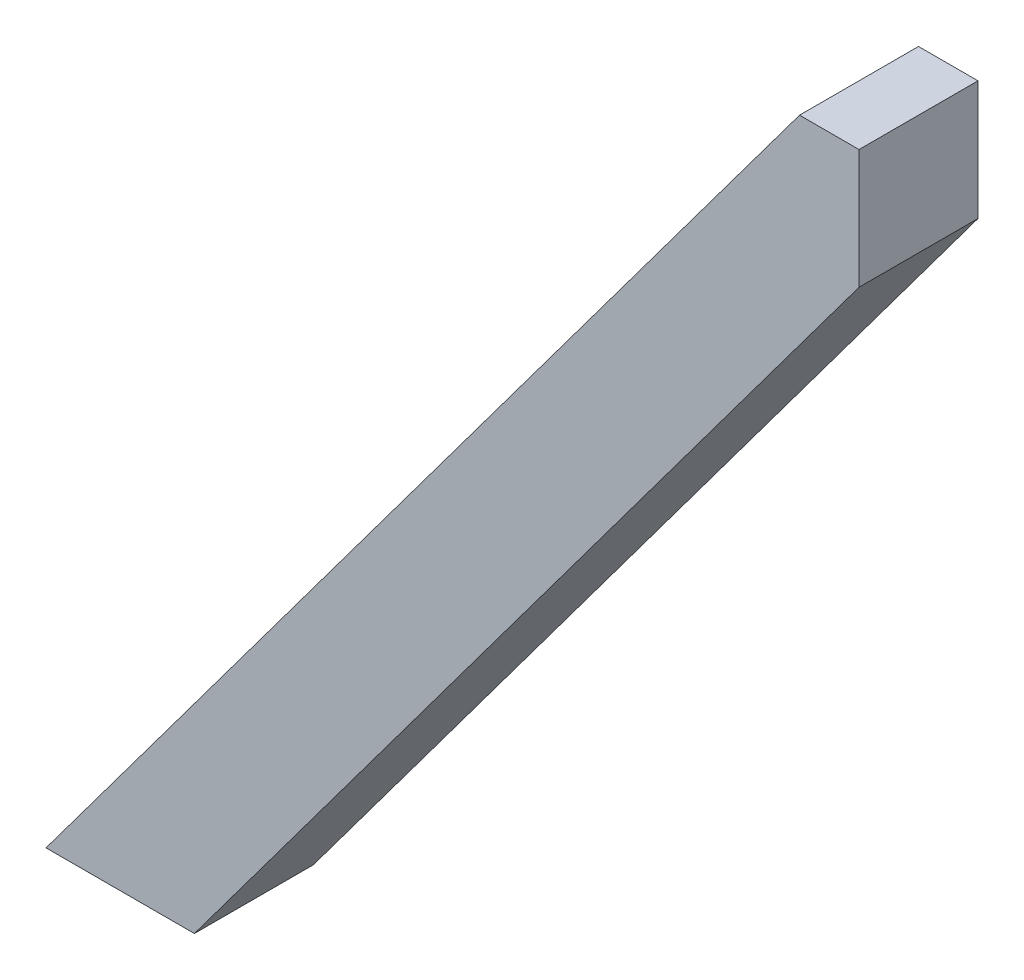
ISO-10303-21;
HEADER;
FILE_DESCRIPTION(('STEP AP214'),'2;1');
FILE_NAME('part.step','',(''),(''),'','','');
FILE_SCHEMA(('AUTOMOTIVE_DESIGN { 1 0 10303 214 1 1 1 1 }'));
ENDSEC;
DATA;
#1=APPLICATION_CONTEXT('core data for automotive mechanical design processes');
#2=APPLICATION_PROTOCOL_DEFINITION('international standard','automotive_design',2000,#1);
#3=PRODUCT_CONTEXT('',#1,'mechanical');
#4=PRODUCT('Part','Part','',(#3));
#5=PRODUCT_RELATED_PRODUCT_CATEGORY('part','',(#4));
#6=PRODUCT_DEFINITION_FORMATION('','',#4);
#7=PRODUCT_DEFINITION_CONTEXT('part definition',#1,'design');
#8=PRODUCT_DEFINITION('design','',#6,#7);
#9=PRODUCT_DEFINITION_SHAPE('','',#8);
#10=(LENGTH_UNIT() NAMED_UNIT(*) SI_UNIT(.MILLI.,.METRE.));
#11=(NAMED_UNIT(*) PLANE_ANGLE_UNIT() SI_UNIT($,.RADIAN.));
#12=(NAMED_UNIT(*) SI_UNIT($,.STERADIAN.) SOLID_ANGLE_UNIT());
#13=UNCERTAINTY_MEASURE_WITH_UNIT(LENGTH_MEASURE(1.E-05),#10,'distance_accuracy_value','');
#14=(GEOMETRIC_REPRESENTATION_CONTEXT(3) GLOBAL_UNCERTAINTY_ASSIGNED_CONTEXT((#13)) GLOBAL_UNIT_ASSIGNED_CONTEXT((#10,
#11,#12)) REPRESENTATION_CONTEXT('',''));
#15=CARTESIAN_POINT('',(0.,0.,0.));
#16=DIRECTION('',(0.,0.,1.));
#17=DIRECTION('',(1.,0.,0.));
#18=AXIS2_PLACEMENT_3D('',#15,#16,#17);
#19=CARTESIAN_POINT('',(482.603129708303,647.69766068999,76.2));
#20=DIRECTION('',(0.801879937296559,-0.597485201625335,0.));
#21=DIRECTION('',(0.597485201625335,0.801879937296559,0.));
#22=AXIS2_PLACEMENT_3D('',#19,#20,#21);
#23=PLANE('',#22);
#24=DIRECTION('',(-0.597485201625335,-0.801879937296559,0.));
#25=VECTOR('',#24,1.);
#26=CARTESIAN_POINT('',(482.603129708303,647.69766068999,0.));
#27=LINE('',#26,#25);
#28=CARTESIAN_POINT('',(482.603129708303,647.69766068999,0.));
#29=VERTEX_POINT('',#28);
#30=CARTESIAN_POINT('',(0.,0.,0.));
#31=VERTEX_POINT('',#30);
#32=EDGE_CURVE('E123',#29,#31,#27,.T.);
#33=ORIENTED_EDGE('',*,*,#32,.T.);
#34=DIRECTION('',(0.,0.,-1.));
#35=VECTOR('',#34,1.);
#36=CARTESIAN_POINT('',(0.,0.,76.2));
#37=LINE('',#36,#35);
#38=CARTESIAN_POINT('',(0.,0.,76.2));
#39=VERTEX_POINT('',#38);
#40=EDGE_CURVE('E11',#39,#31,#37,.T.);
#41=ORIENTED_EDGE('',*,*,#40,.F.);
#42=DIRECTION('',(-0.597485201625335,-0.801879937296559,0.));
#43=VECTOR('',#42,1.);
#44=CARTESIAN_POINT('',(482.603129708303,647.69766068999,76.2));
#45=LINE('',#44,#43);
#46=CARTESIAN_POINT('',(482.603129708303,647.69766068999,76.2));
#47=VERTEX_POINT('',#46);
#48=EDGE_CURVE('E136',#47,#39,#45,.T.);
#49=ORIENTED_EDGE('',*,*,#48,.F.);
#50=DIRECTION('',(0.,0.,-1.));
#51=VECTOR('',#50,1.);
#52=CARTESIAN_POINT('',(482.603129708303,647.69766068999,76.2));
#53=LINE('',#52,#51);
#54=EDGE_CURVE('E119',#47,#29,#53,.T.);
#55=ORIENTED_EDGE('',*,*,#54,.T.);
#56=EDGE_LOOP('',(#33,#41,#49,#55));
#57=FACE_BOUND('',#56,.T.);
#58=ADVANCED_FACE('F43',(#57),#23,.F.);
#59=CARTESIAN_POINT('',(0.,0.,76.2));
#60=DIRECTION('',(0.,1.,0.));
#61=DIRECTION('',(0.,0.,1.));
#62=AXIS2_PLACEMENT_3D('',#59,#60,#61);
#63=PLANE('',#62);
#64=DIRECTION('',(1.,0.,0.));
#65=VECTOR('',#64,1.);
#66=CARTESIAN_POINT('',(0.,0.,0.));
#67=LINE('',#66,#65);
#68=CARTESIAN_POINT('',(95.0266947155444,0.,0.));
#69=VERTEX_POINT('',#68);
#70=EDGE_CURVE('E127',#31,#69,#67,.T.);
#71=ORIENTED_EDGE('',*,*,#70,.T.);
#72=DIRECTION('',(0.,0.,-1.));
#73=VECTOR('',#72,1.);
#74=CARTESIAN_POINT('',(95.0266947155444,0.,76.2));
#75=LINE('',#74,#73);
#76=CARTESIAN_POINT('',(95.0266947155444,0.,76.2));
#77=VERTEX_POINT('',#76);
#78=EDGE_CURVE('E52',#77,#69,#75,.T.);
#79=ORIENTED_EDGE('',*,*,#78,.F.);
#80=DIRECTION('',(1.,0.,0.));
#81=VECTOR('',#80,1.);
#82=CARTESIAN_POINT('',(0.,0.,76.2));
#83=LINE('',#82,#81);
#84=EDGE_CURVE('E94',#39,#77,#83,.T.);
#85=ORIENTED_EDGE('',*,*,#84,.F.);
#86=ORIENTED_EDGE('',*,*,#40,.T.);
#87=EDGE_LOOP('',(#71,#79,#85,#86));
#88=FACE_BOUND('',#87,.T.);
#89=ADVANCED_FACE('F159',(#88),#63,.F.);
#90=CARTESIAN_POINT('',(95.0266947155444,0.,76.2));
#91=DIRECTION('',(-0.801879937296559,0.597485201625335,0.));
#92=DIRECTION('',(-0.597485201625335,-0.801879937296559,0.));
#93=AXIS2_PLACEMENT_3D('',#90,#91,#92);
#94=PLANE('',#93);
#95=DIRECTION('',(0.597485201625335,0.801879937296559,0.));
#96=VECTOR('',#95,1.);
#97=CARTESIAN_POINT('',(95.0266947155444,0.,0.));
#98=LINE('',#97,#96);
#99=CARTESIAN_POINT('',(520.703129708303,571.296815506169,0.));
#100=VERTEX_POINT('',#99);
#101=EDGE_CURVE('E110',#69,#100,#98,.T.);
#102=ORIENTED_EDGE('',*,*,#101,.T.);
#103=DIRECTION('',(0.,0.,-1.));
#104=VECTOR('',#103,1.);
#105=CARTESIAN_POINT('',(520.703129708303,571.296815506169,76.2));
#106=LINE('',#105,#104);
#107=CARTESIAN_POINT('',(520.703129708303,571.296815506169,76.2));
#108=VERTEX_POINT('',#107);
#109=EDGE_CURVE('E107',#108,#100,#106,.T.);
#110=ORIENTED_EDGE('',*,*,#109,.F.);
#111=DIRECTION('',(0.597485201625335,0.801879937296559,0.));
#112=VECTOR('',#111,1.);
#113=CARTESIAN_POINT('',(95.0266947155444,0.,76.2));
#114=LINE('',#113,#112);
#115=EDGE_CURVE('E98',#77,#108,#114,.T.);
#116=ORIENTED_EDGE('',*,*,#115,.F.);
#117=ORIENTED_EDGE('',*,*,#78,.T.);
#118=EDGE_LOOP('',(#102,#110,#116,#117));
#119=FACE_BOUND('',#118,.T.);
#120=ADVANCED_FACE('F108',(#119),#94,.F.);
#121=CARTESIAN_POINT('',(520.703129708303,571.296815506169,76.2));
#122=DIRECTION('',(-1.,0.,0.));
#123=DIRECTION('',(0.,0.,1.));
#124=AXIS2_PLACEMENT_3D('',#121,#122,#123);
#125=PLANE('',#124);
#126=DIRECTION('',(0.,1.,0.));
#127=VECTOR('',#126,1.);
#128=CARTESIAN_POINT('',(520.703129708303,571.296815506169,0.));
#129=LINE('',#128,#127);
#130=CARTESIAN_POINT('',(520.703129708303,647.69766068999,0.));
#131=VERTEX_POINT('',#130);
#132=EDGE_CURVE('E80',#100,#131,#129,.T.);
#133=ORIENTED_EDGE('',*,*,#132,.T.);
#134=DIRECTION('',(0.,0.,-1.));
#135=VECTOR('',#134,1.);
#136=CARTESIAN_POINT('',(520.703129708303,647.69766068999,76.2));
#137=LINE('',#136,#135);
#138=CARTESIAN_POINT('',(520.703129708303,647.69766068999,76.2));
#139=VERTEX_POINT('',#138);
#140=EDGE_CURVE('E112',#139,#131,#137,.T.);
#141=ORIENTED_EDGE('',*,*,#140,.F.);
#142=DIRECTION('',(0.,1.,0.));
#143=VECTOR('',#142,1.);
#144=CARTESIAN_POINT('',(520.703129708303,571.296815506169,76.2));
#145=LINE('',#144,#143);
#146=EDGE_CURVE('E102',#108,#139,#145,.T.);
#147=ORIENTED_EDGE('',*,*,#146,.F.);
#148=ORIENTED_EDGE('',*,*,#109,.T.);
#149=EDGE_LOOP('',(#133,#141,#147,#148));
#150=FACE_BOUND('',#149,.T.);
#151=ADVANCED_FACE('F114',(#150),#125,.F.);
#152=CARTESIAN_POINT('',(520.703129708303,647.69766068999,76.2));
#153=DIRECTION('',(0.,-1.,0.));
#154=DIRECTION('',(0.,0.,-1.));
#155=AXIS2_PLACEMENT_3D('',#152,#153,#154);
#156=PLANE('',#155);
#157=DIRECTION('',(-1.,0.,0.));
#158=VECTOR('',#157,1.);
#159=CARTESIAN_POINT('',(520.703129708303,647.69766068999,0.));
#160=LINE('',#159,#158);
#161=EDGE_CURVE('E86',#131,#29,#160,.T.);
#162=ORIENTED_EDGE('',*,*,#161,.T.);
#163=ORIENTED_EDGE('',*,*,#54,.F.);
#164=DIRECTION('',(-1.,0.,0.));
#165=VECTOR('',#164,1.);
#166=CARTESIAN_POINT('',(520.703129708303,647.69766068999,76.2));
#167=LINE('',#166,#165);
#168=EDGE_CURVE('E60',#139,#47,#167,.T.);
#169=ORIENTED_EDGE('',*,*,#168,.F.);
#170=ORIENTED_EDGE('',*,*,#140,.T.);
#171=EDGE_LOOP('',(#162,#163,#169,#170));
#172=FACE_BOUND('',#171,.T.);
#173=ADVANCED_FACE('F148',(#172),#156,.F.);
#174=CARTESIAN_POINT('',(0.,0.,76.2));
#175=DIRECTION('',(0.,0.,1.));
#176=DIRECTION('',(1.,0.,0.));
#177=AXIS2_PLACEMENT_3D('',#174,#175,#176);
#178=PLANE('',#177);
#179=ORIENTED_EDGE('',*,*,#48,.T.);
#180=ORIENTED_EDGE('',*,*,#84,.T.);
#181=ORIENTED_EDGE('',*,*,#115,.T.);
#182=ORIENTED_EDGE('',*,*,#146,.T.);
#183=ORIENTED_EDGE('',*,*,#168,.T.);
#184=EDGE_LOOP('',(#179,#180,#181,#182,#183));
#185=FACE_BOUND('',#184,.T.);
#186=ADVANCED_FACE('F100',(#185),#178,.T.);
#187=CARTESIAN_POINT('',(0.,0.,0.));
#188=DIRECTION('',(0.,0.,1.));
#189=DIRECTION('',(1.,0.,0.));
#190=AXIS2_PLACEMENT_3D('',#187,#188,#189);
#191=PLANE('',#190);
#192=ORIENTED_EDGE('',*,*,#32,.F.);
#193=ORIENTED_EDGE('',*,*,#161,.F.);
#194=ORIENTED_EDGE('',*,*,#132,.F.);
#195=ORIENTED_EDGE('',*,*,#101,.F.);
#196=ORIENTED_EDGE('',*,*,#70,.F.);
#197=EDGE_LOOP('',(#192,#193,#194,#195,#196));
#198=FACE_BOUND('',#197,.T.);
#199=ADVANCED_FACE('F144',(#198),#191,.F.);
#200=CLOSED_SHELL('',(#58,#89,#120,#151,#173,#186,#199));
#201=MANIFOLD_SOLID_BREP('B2',#200);
#202=ADVANCED_BREP_SHAPE_REPRESENTATION('',(#18,#201),#14);
#203=SHAPE_DEFINITION_REPRESENTATION(#9,#202);
ENDSEC;
END-ISO-10303-21;
